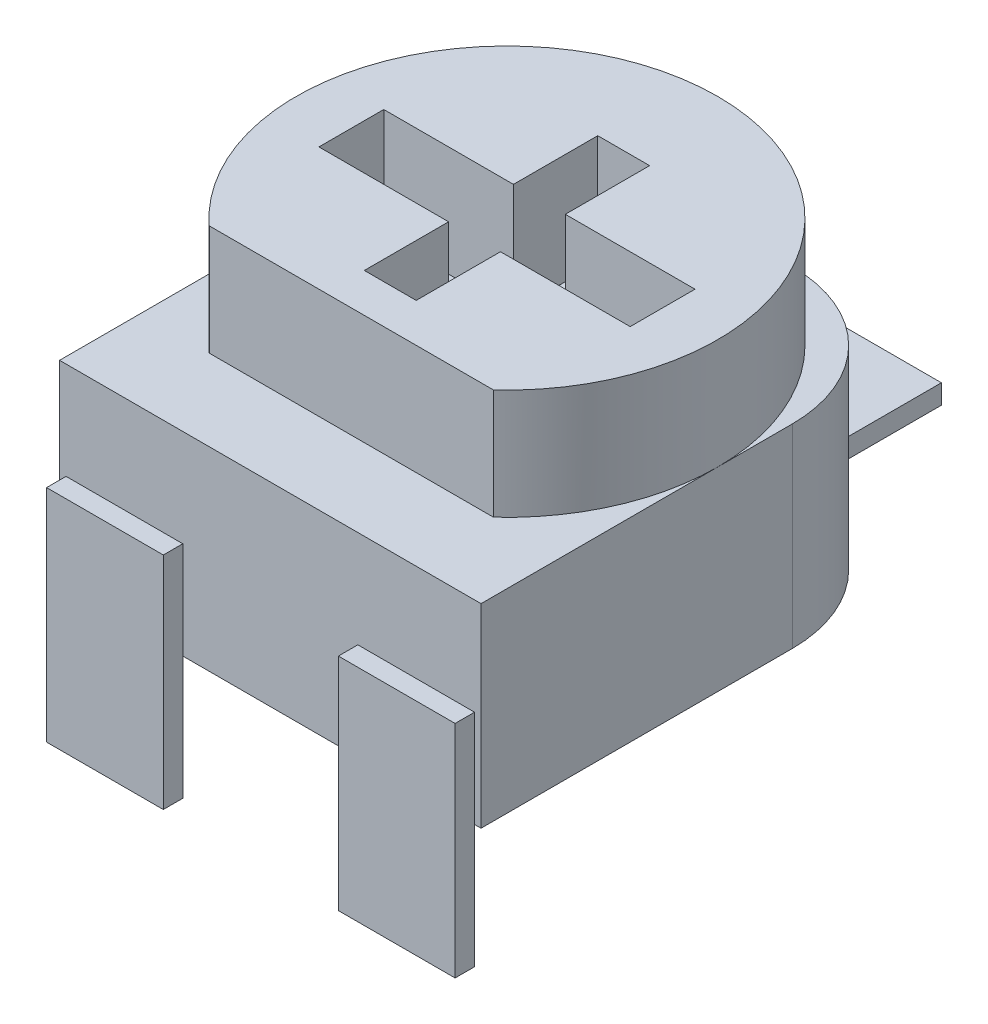
ISO-10303-21;
HEADER;
FILE_DESCRIPTION(('STEP AP214'),'2;1');
FILE_NAME('part.step','',(''),(''),'','','');
FILE_SCHEMA(('AUTOMOTIVE_DESIGN { 1 0 10303 214 1 1 1 1 }'));
ENDSEC;
DATA;
#1=APPLICATION_CONTEXT('core data for automotive mechanical design processes');
#2=APPLICATION_PROTOCOL_DEFINITION('international standard','automotive_design',2000,#1);
#3=PRODUCT_CONTEXT('',#1,'mechanical');
#4=PRODUCT('Part','Part','',(#3));
#5=PRODUCT_RELATED_PRODUCT_CATEGORY('part','',(#4));
#6=PRODUCT_DEFINITION_FORMATION('','',#4);
#7=PRODUCT_DEFINITION_CONTEXT('part definition',#1,'design');
#8=PRODUCT_DEFINITION('design','',#6,#7);
#9=PRODUCT_DEFINITION_SHAPE('','',#8);
#10=(LENGTH_UNIT() NAMED_UNIT(*) SI_UNIT(.MILLI.,.METRE.));
#11=(NAMED_UNIT(*) PLANE_ANGLE_UNIT() SI_UNIT($,.RADIAN.));
#12=(NAMED_UNIT(*) SI_UNIT($,.STERADIAN.) SOLID_ANGLE_UNIT());
#13=UNCERTAINTY_MEASURE_WITH_UNIT(LENGTH_MEASURE(1.E-05),#10,'distance_accuracy_value','');
#14=(GEOMETRIC_REPRESENTATION_CONTEXT(3) GLOBAL_UNCERTAINTY_ASSIGNED_CONTEXT((#13)) GLOBAL_UNIT_ASSIGNED_CONTEXT((#10,
#11,#12)) REPRESENTATION_CONTEXT('',''));
#15=CARTESIAN_POINT('',(0.,0.,0.));
#16=DIRECTION('',(0.,0.,1.));
#17=DIRECTION('',(1.,0.,0.));
#18=AXIS2_PLACEMENT_3D('',#15,#16,#17);
#19=CARTESIAN_POINT('',(-3.25,3.,-3.25));
#20=DIRECTION('',(0.,0.,-1.));
#21=DIRECTION('',(-1.,0.,0.));
#22=AXIS2_PLACEMENT_3D('',#19,#20,#21);
#23=PLANE('',#22);
#24=DIRECTION('',(0.,-1.,0.));
#25=VECTOR('',#24,1.);
#26=CARTESIAN_POINT('',(1.15,3.,-3.25));
#27=LINE('',#26,#25);
#28=CARTESIAN_POINT('',(1.15,3.,-3.25));
#29=VERTEX_POINT('',#28);
#30=CARTESIAN_POINT('',(1.15,0.3,-3.25));
#31=VERTEX_POINT('',#30);
#32=EDGE_CURVE('E540',#29,#31,#27,.T.);
#33=ORIENTED_EDGE('',*,*,#32,.T.);
#34=DIRECTION('',(1.,0.,0.));
#35=VECTOR('',#34,1.);
#36=CARTESIAN_POINT('',(1.15,0.3,-3.25));
#37=LINE('',#36,#35);
#38=CARTESIAN_POINT('',(-1.15,0.3,-3.25));
#39=VERTEX_POINT('',#38);
#40=EDGE_CURVE('E335',#39,#31,#37,.T.);
#41=ORIENTED_EDGE('',*,*,#40,.F.);
#42=DIRECTION('',(0.,-1.,0.));
#43=VECTOR('',#42,1.);
#44=CARTESIAN_POINT('',(-1.15,3.,-3.25));
#45=LINE('',#44,#43);
#46=CARTESIAN_POINT('',(-1.15,3.,-3.25));
#47=VERTEX_POINT('',#46);
#48=EDGE_CURVE('E541',#39,#47,#45,.F.);
#49=ORIENTED_EDGE('',*,*,#48,.T.);
#50=DIRECTION('',(1.,0.,0.));
#51=VECTOR('',#50,1.);
#52=CARTESIAN_POINT('',(-3.25,3.,-3.25));
#53=LINE('',#52,#51);
#54=CARTESIAN_POINT('',(0.,3.,-3.25));
#55=VERTEX_POINT('',#54);
#56=EDGE_CURVE('E511',#47,#55,#53,.T.);
#57=ORIENTED_EDGE('',*,*,#56,.T.);
#58=EDGE_CURVE('E514',#55,#29,#53,.T.);
#59=ORIENTED_EDGE('',*,*,#58,.T.);
#60=EDGE_LOOP('',(#33,#41,#49,#57,#59));
#61=FACE_BOUND('',#60,.T.);
#62=ADVANCED_FACE('F91',(#61),#23,.T.);
#63=CARTESIAN_POINT('',(-3.25,3.,3.65));
#64=DIRECTION('',(0.,0.,-1.));
#65=DIRECTION('',(-1.,0.,0.));
#66=AXIS2_PLACEMENT_3D('',#63,#64,#65);
#67=PLANE('',#66);
#68=DIRECTION('',(0.,-1.,0.));
#69=VECTOR('',#68,1.);
#70=CARTESIAN_POINT('',(1.35,1.5,3.65));
#71=LINE('',#70,#69);
#72=CARTESIAN_POINT('',(1.35,1.5,3.65));
#73=VERTEX_POINT('',#72);
#74=CARTESIAN_POINT('',(1.35,0.,3.65));
#75=VERTEX_POINT('',#74);
#76=EDGE_CURVE('E114',#73,#75,#71,.T.);
#77=ORIENTED_EDGE('',*,*,#76,.F.);
#78=DIRECTION('',(1.,0.,0.));
#79=VECTOR('',#78,1.);
#80=CARTESIAN_POINT('',(1.35,1.5,3.65));
#81=LINE('',#80,#79);
#82=CARTESIAN_POINT('',(3.15,1.5,3.65));
#83=VERTEX_POINT('',#82);
#84=EDGE_CURVE('E364',#73,#83,#81,.T.);
#85=ORIENTED_EDGE('',*,*,#84,.T.);
#86=DIRECTION('',(0.,-1.,0.));
#87=VECTOR('',#86,1.);
#88=CARTESIAN_POINT('',(3.15,1.5,3.65));
#89=LINE('',#88,#87);
#90=CARTESIAN_POINT('',(3.15,0.,3.65));
#91=VERTEX_POINT('',#90);
#92=EDGE_CURVE('E361',#83,#91,#89,.T.);
#93=ORIENTED_EDGE('',*,*,#92,.T.);
#94=DIRECTION('',(1.,0.,0.));
#95=VECTOR('',#94,1.);
#96=CARTESIAN_POINT('',(-3.25,0.,3.65));
#97=LINE('',#96,#95);
#98=CARTESIAN_POINT('',(3.25,0.,3.65));
#99=VERTEX_POINT('',#98);
#100=EDGE_CURVE('E526',#91,#99,#97,.T.);
#101=ORIENTED_EDGE('',*,*,#100,.T.);
#102=DIRECTION('',(0.,-1.,0.));
#103=VECTOR('',#102,1.);
#104=CARTESIAN_POINT('',(3.25,3.,3.65));
#105=LINE('',#104,#103);
#106=CARTESIAN_POINT('',(3.25,3.,3.65));
#107=VERTEX_POINT('',#106);
#108=EDGE_CURVE('E523',#107,#99,#105,.T.);
#109=ORIENTED_EDGE('',*,*,#108,.F.);
#110=DIRECTION('',(1.,0.,0.));
#111=VECTOR('',#110,1.);
#112=CARTESIAN_POINT('',(-3.25,3.,3.65));
#113=LINE('',#112,#111);
#114=CARTESIAN_POINT('',(-3.25,3.,3.65));
#115=VERTEX_POINT('',#114);
#116=EDGE_CURVE('E517',#115,#107,#113,.T.);
#117=ORIENTED_EDGE('',*,*,#116,.F.);
#118=DIRECTION('',(0.,-1.,0.));
#119=VECTOR('',#118,1.);
#120=CARTESIAN_POINT('',(-3.25,3.,3.65));
#121=LINE('',#120,#119);
#122=CARTESIAN_POINT('',(-3.25,0.,3.65));
#123=VERTEX_POINT('',#122);
#124=EDGE_CURVE('E532',#115,#123,#121,.T.);
#125=ORIENTED_EDGE('',*,*,#124,.T.);
#126=CARTESIAN_POINT('',(-3.15,0.,3.65));
#127=VERTEX_POINT('',#126);
#128=EDGE_CURVE('E527',#123,#127,#97,.T.);
#129=ORIENTED_EDGE('',*,*,#128,.T.);
#130=DIRECTION('',(0.,-1.,0.));
#131=VECTOR('',#130,1.);
#132=CARTESIAN_POINT('',(-3.15,1.5,3.65));
#133=LINE('',#132,#131);
#134=CARTESIAN_POINT('',(-3.15,1.5,3.65));
#135=VERTEX_POINT('',#134);
#136=EDGE_CURVE('E380',#135,#127,#133,.T.);
#137=ORIENTED_EDGE('',*,*,#136,.F.);
#138=DIRECTION('',(1.,0.,0.));
#139=VECTOR('',#138,1.);
#140=CARTESIAN_POINT('',(-3.15,1.5,3.65));
#141=LINE('',#140,#139);
#142=CARTESIAN_POINT('',(-1.35,1.5,3.65));
#143=VERTEX_POINT('',#142);
#144=EDGE_CURVE('E366',#135,#143,#141,.T.);
#145=ORIENTED_EDGE('',*,*,#144,.T.);
#146=DIRECTION('',(0.,-1.,0.));
#147=VECTOR('',#146,1.);
#148=CARTESIAN_POINT('',(-1.35,1.5,3.65));
#149=LINE('',#148,#147);
#150=CARTESIAN_POINT('',(-1.35,0.,3.65));
#151=VERTEX_POINT('',#150);
#152=EDGE_CURVE('E390',#143,#151,#149,.T.);
#153=ORIENTED_EDGE('',*,*,#152,.T.);
#154=EDGE_CURVE('E1038',#151,#75,#97,.T.);
#155=ORIENTED_EDGE('',*,*,#154,.T.);
#156=EDGE_LOOP('',(#77,#85,#93,#101,#109,#117,#125,#129,#137,#145,#153,#155));
#157=FACE_BOUND('',#156,.T.);
#158=ADVANCED_FACE('F566',(#157),#67,.F.);
#159=CARTESIAN_POINT('',(0.,4.7,0.));
#160=DIRECTION('',(0.,-1.,0.));
#161=DIRECTION('',(0.,0.,-1.));
#162=AXIS2_PLACEMENT_3D('',#159,#160,#161);
#163=PLANE('',#162);
#164=DIRECTION('',(1.,0.,0.));
#165=VECTOR('',#164,1.);
#166=CARTESIAN_POINT('',(0.,4.7,1.8));
#167=LINE('',#166,#165);
#168=CARTESIAN_POINT('',(-0.4,4.7,1.8));
#169=VERTEX_POINT('',#168);
#170=CARTESIAN_POINT('',(0.4,4.7,1.8));
#171=VERTEX_POINT('',#170);
#172=EDGE_CURVE('E427',#169,#171,#167,.T.);
#173=ORIENTED_EDGE('',*,*,#172,.F.);
#174=DIRECTION('',(0.,0.,-1.));
#175=VECTOR('',#174,1.);
#176=CARTESIAN_POINT('',(-0.4,4.7,0.));
#177=LINE('',#176,#175);
#178=CARTESIAN_POINT('',(-0.4,4.7,0.5));
#179=VERTEX_POINT('',#178);
#180=EDGE_CURVE('E430',#169,#179,#177,.T.);
#181=ORIENTED_EDGE('',*,*,#180,.T.);
#182=DIRECTION('',(1.,0.,0.));
#183=VECTOR('',#182,1.);
#184=CARTESIAN_POINT('',(0.,4.7,0.5));
#185=LINE('',#184,#183);
#186=CARTESIAN_POINT('',(-2.4,4.7,0.5));
#187=VERTEX_POINT('',#186);
#188=EDGE_CURVE('E472',#187,#179,#185,.T.);
#189=ORIENTED_EDGE('',*,*,#188,.F.);
#190=DIRECTION('',(0.,0.,-1.));
#191=VECTOR('',#190,1.);
#192=CARTESIAN_POINT('',(-2.4,4.7,0.));
#193=LINE('',#192,#191);
#194=CARTESIAN_POINT('',(-2.4,4.7,-0.5));
#195=VERTEX_POINT('',#194);
#196=EDGE_CURVE('E468',#187,#195,#193,.T.);
#197=ORIENTED_EDGE('',*,*,#196,.T.);
#198=DIRECTION('',(1.,0.,0.));
#199=VECTOR('',#198,1.);
#200=CARTESIAN_POINT('',(0.,4.7,-0.5));
#201=LINE('',#200,#199);
#202=CARTESIAN_POINT('',(-0.4,4.7,-0.5));
#203=VERTEX_POINT('',#202);
#204=EDGE_CURVE('E465',#195,#203,#201,.T.);
#205=ORIENTED_EDGE('',*,*,#204,.T.);
#206=CARTESIAN_POINT('',(-0.4,4.7,-1.8));
#207=VERTEX_POINT('',#206);
#208=EDGE_CURVE('E429',#203,#207,#177,.T.);
#209=ORIENTED_EDGE('',*,*,#208,.T.);
#210=DIRECTION('',(1.,0.,0.));
#211=VECTOR('',#210,1.);
#212=CARTESIAN_POINT('',(0.,4.7,-1.8));
#213=LINE('',#212,#211);
#214=CARTESIAN_POINT('',(0.4,4.7,-1.8));
#215=VERTEX_POINT('',#214);
#216=EDGE_CURVE('E420',#207,#215,#213,.T.);
#217=ORIENTED_EDGE('',*,*,#216,.T.);
#218=DIRECTION('',(0.,0.,-1.));
#219=VECTOR('',#218,1.);
#220=CARTESIAN_POINT('',(0.4,4.7,0.));
#221=LINE('',#220,#219);
#222=CARTESIAN_POINT('',(0.4,4.7,-0.5));
#223=VERTEX_POINT('',#222);
#224=EDGE_CURVE('E423',#223,#215,#221,.T.);
#225=ORIENTED_EDGE('',*,*,#224,.F.);
#226=CARTESIAN_POINT('',(2.4,4.7,-0.5));
#227=VERTEX_POINT('',#226);
#228=EDGE_CURVE('E463',#223,#227,#201,.T.);
#229=ORIENTED_EDGE('',*,*,#228,.T.);
#230=DIRECTION('',(0.,0.,-1.));
#231=VECTOR('',#230,1.);
#232=CARTESIAN_POINT('',(2.4,4.7,0.));
#233=LINE('',#232,#231);
#234=CARTESIAN_POINT('',(2.4,4.7,0.5));
#235=VERTEX_POINT('',#234);
#236=EDGE_CURVE('E460',#235,#227,#233,.T.);
#237=ORIENTED_EDGE('',*,*,#236,.F.);
#238=CARTESIAN_POINT('',(0.4,4.7,0.5));
#239=VERTEX_POINT('',#238);
#240=EDGE_CURVE('E471',#239,#235,#185,.T.);
#241=ORIENTED_EDGE('',*,*,#240,.F.);
#242=EDGE_CURVE('E425',#171,#239,#221,.T.);
#243=ORIENTED_EDGE('',*,*,#242,.F.);
#244=EDGE_LOOP('',(#173,#181,#189,#197,#205,#209,#217,#225,#229,#237,#241,#243));
#245=FACE_BOUND('',#244,.T.);
#246=DIRECTION('',(1.,0.,0.));
#247=VECTOR('',#246,1.);
#248=CARTESIAN_POINT('',(0.,4.7,2.4));
#249=LINE('',#248,#247);
#250=CARTESIAN_POINT('',(-2.19146070008111,4.7,2.4));
#251=VERTEX_POINT('',#250);
#252=CARTESIAN_POINT('',(2.19146070008111,4.7,2.4));
#253=VERTEX_POINT('',#252);
#254=EDGE_CURVE('E410',#251,#253,#249,.T.);
#255=ORIENTED_EDGE('',*,*,#254,.T.);
#256=CARTESIAN_POINT('',(0.,4.7,0.));
#257=DIRECTION('',(0.,-1.,0.));
#258=DIRECTION('',(0.,0.,-1.));
#259=AXIS2_PLACEMENT_3D('',#256,#257,#258);
#260=CIRCLE('',#259,3.25);
#261=EDGE_CURVE('E498',#251,#253,#260,.T.);
#262=ORIENTED_EDGE('',*,*,#261,.F.);
#263=EDGE_LOOP('',(#255,#262));
#264=FACE_BOUND('',#263,.T.);
#265=ADVANCED_FACE('F607',(#245,#264),#163,.F.);
#266=CARTESIAN_POINT('',(0.,4.7,0.));
#267=DIRECTION('',(0.,-1.,0.));
#268=DIRECTION('',(0.,0.,-1.));
#269=AXIS2_PLACEMENT_3D('',#266,#267,#268);
#270=CYLINDRICAL_SURFACE('',#269,3.25);
#271=CARTESIAN_POINT('',(0.,3.,0.));
#272=DIRECTION('',(0.,-1.,0.));
#273=DIRECTION('',(0.,0.,-1.));
#274=AXIS2_PLACEMENT_3D('',#271,#272,#273);
#275=CIRCLE('',#274,3.25);
#276=CARTESIAN_POINT('',(-2.19146070008111,3.,2.4));
#277=VERTEX_POINT('',#276);
#278=CARTESIAN_POINT('',(-3.25,3.,0.));
#279=VERTEX_POINT('',#278);
#280=EDGE_CURVE('E504',#277,#279,#275,.T.);
#281=ORIENTED_EDGE('',*,*,#280,.F.);
#282=DIRECTION('',(0.,1.,0.));
#283=VECTOR('',#282,1.);
#284=CARTESIAN_POINT('',(-2.19146070008111,-1.4645828472546,2.4));
#285=LINE('',#284,#283);
#286=EDGE_CURVE('E414',#277,#251,#285,.T.);
#287=ORIENTED_EDGE('',*,*,#286,.T.);
#288=ORIENTED_EDGE('',*,*,#261,.T.);
#289=DIRECTION('',(0.,1.,0.));
#290=VECTOR('',#289,1.);
#291=CARTESIAN_POINT('',(2.19146070008111,-1.4645828472546,2.4));
#292=LINE('',#291,#290);
#293=CARTESIAN_POINT('',(2.19146070008111,3.,2.4));
#294=VERTEX_POINT('',#293);
#295=EDGE_CURVE('E401',#294,#253,#292,.T.);
#296=ORIENTED_EDGE('',*,*,#295,.F.);
#297=CARTESIAN_POINT('',(3.25,3.,0.));
#298=VERTEX_POINT('',#297);
#299=EDGE_CURVE('E578',#298,#294,#275,.T.);
#300=ORIENTED_EDGE('',*,*,#299,.F.);
#301=EDGE_CURVE('E497',#55,#298,#275,.T.);
#302=ORIENTED_EDGE('',*,*,#301,.F.);
#303=EDGE_CURVE('E505',#279,#55,#275,.T.);
#304=ORIENTED_EDGE('',*,*,#303,.F.);
#305=EDGE_LOOP('',(#281,#287,#288,#296,#300,#302,#304));
#306=FACE_BOUND('',#305,.T.);
#307=ADVANCED_FACE('F581',(#306),#270,.T.);
#308=CARTESIAN_POINT('',(0.,3.,0.));
#309=DIRECTION('',(0.,-1.,0.));
#310=DIRECTION('',(0.,0.,-1.));
#311=AXIS2_PLACEMENT_3D('',#308,#309,#310);
#312=PLANE('',#311);
#313=DIRECTION('',(0.,0.,1.));
#314=VECTOR('',#313,1.);
#315=CARTESIAN_POINT('',(3.25,3.,-3.25));
#316=LINE('',#315,#314);
#317=CARTESIAN_POINT('',(3.25,3.,-1.15));
#318=VERTEX_POINT('',#317);
#319=EDGE_CURVE('E515',#318,#298,#316,.T.);
#320=ORIENTED_EDGE('',*,*,#319,.F.);
#321=CARTESIAN_POINT('',(1.15,3.,-1.15));
#322=DIRECTION('',(0.,-1.,0.));
#323=DIRECTION('',(0.,0.,-1.));
#324=AXIS2_PLACEMENT_3D('',#321,#322,#323);
#325=CIRCLE('',#324,2.1);
#326=EDGE_CURVE('E549',#318,#29,#325,.F.);
#327=ORIENTED_EDGE('',*,*,#326,.T.);
#328=ORIENTED_EDGE('',*,*,#58,.F.);
#329=ORIENTED_EDGE('',*,*,#301,.T.);
#330=EDGE_LOOP('',(#320,#327,#328,#329));
#331=FACE_BOUND('',#330,.T.);
#332=ADVANCED_FACE('F624',(#331),#312,.F.);
#333=EDGE_CURVE('E513',#298,#107,#316,.T.);
#334=ORIENTED_EDGE('',*,*,#333,.F.);
#335=ORIENTED_EDGE('',*,*,#299,.T.);
#336=DIRECTION('',(1.,0.,0.));
#337=VECTOR('',#336,1.);
#338=CARTESIAN_POINT('',(0.,3.,2.4));
#339=LINE('',#338,#337);
#340=EDGE_CURVE('E413',#277,#294,#339,.T.);
#341=ORIENTED_EDGE('',*,*,#340,.F.);
#342=ORIENTED_EDGE('',*,*,#280,.T.);
#343=DIRECTION('',(0.,0.,1.));
#344=VECTOR('',#343,1.);
#345=CARTESIAN_POINT('',(-3.25,3.,-3.25));
#346=LINE('',#345,#344);
#347=EDGE_CURVE('E520',#279,#115,#346,.T.);
#348=ORIENTED_EDGE('',*,*,#347,.T.);
#349=ORIENTED_EDGE('',*,*,#116,.T.);
#350=EDGE_LOOP('',(#334,#335,#341,#342,#348,#349));
#351=FACE_BOUND('',#350,.T.);
#352=ADVANCED_FACE('F572',(#351),#312,.F.);
#353=CARTESIAN_POINT('',(-3.25,3.,-3.25));
#354=DIRECTION('',(1.,0.,0.));
#355=DIRECTION('',(0.,0.,-1.));
#356=AXIS2_PLACEMENT_3D('',#353,#354,#355);
#357=PLANE('',#356);
#358=CARTESIAN_POINT('',(-3.25,3.,-1.15));
#359=VERTEX_POINT('',#358);
#360=EDGE_CURVE('E521',#359,#279,#346,.T.);
#361=ORIENTED_EDGE('',*,*,#360,.F.);
#362=DIRECTION('',(0.,-1.,0.));
#363=VECTOR('',#362,1.);
#364=CARTESIAN_POINT('',(-3.25,0.,-1.15));
#365=LINE('',#364,#363);
#366=CARTESIAN_POINT('',(-3.25,0.,-1.15));
#367=VERTEX_POINT('',#366);
#368=EDGE_CURVE('E99',#359,#367,#365,.T.);
#369=ORIENTED_EDGE('',*,*,#368,.T.);
#370=DIRECTION('',(0.,0.,1.));
#371=VECTOR('',#370,1.);
#372=CARTESIAN_POINT('',(-3.25,0.,-3.25));
#373=LINE('',#372,#371);
#374=EDGE_CURVE('E529',#367,#123,#373,.T.);
#375=ORIENTED_EDGE('',*,*,#374,.T.);
#376=ORIENTED_EDGE('',*,*,#124,.F.);
#377=ORIENTED_EDGE('',*,*,#347,.F.);
#378=EDGE_LOOP('',(#361,#369,#375,#376,#377));
#379=FACE_BOUND('',#378,.T.);
#380=ADVANCED_FACE('F555',(#379),#357,.F.);
#381=CARTESIAN_POINT('',(3.25,3.,-3.25));
#382=DIRECTION('',(1.,0.,0.));
#383=DIRECTION('',(0.,0.,-1.));
#384=AXIS2_PLACEMENT_3D('',#381,#382,#383);
#385=PLANE('',#384);
#386=DIRECTION('',(0.,0.,1.));
#387=VECTOR('',#386,1.);
#388=CARTESIAN_POINT('',(3.25,0.,-3.25));
#389=LINE('',#388,#387);
#390=CARTESIAN_POINT('',(3.25,0.,-1.15));
#391=VERTEX_POINT('',#390);
#392=EDGE_CURVE('E510',#391,#99,#389,.T.);
#393=ORIENTED_EDGE('',*,*,#392,.F.);
#394=DIRECTION('',(0.,-1.,0.));
#395=VECTOR('',#394,1.);
#396=CARTESIAN_POINT('',(3.25,3.,-1.15));
#397=LINE('',#396,#395);
#398=EDGE_CURVE('E547',#391,#318,#397,.F.);
#399=ORIENTED_EDGE('',*,*,#398,.T.);
#400=ORIENTED_EDGE('',*,*,#319,.T.);
#401=ORIENTED_EDGE('',*,*,#333,.T.);
#402=ORIENTED_EDGE('',*,*,#108,.T.);
#403=EDGE_LOOP('',(#393,#399,#400,#401,#402));
#404=FACE_BOUND('',#403,.T.);
#405=ADVANCED_FACE('F610',(#404),#385,.T.);
#406=ORIENTED_EDGE('',*,*,#56,.F.);
#407=CARTESIAN_POINT('',(-1.15,3.,-1.15));
#408=DIRECTION('',(0.,-1.,0.));
#409=DIRECTION('',(0.,0.,-1.));
#410=AXIS2_PLACEMENT_3D('',#407,#408,#409);
#411=CIRCLE('',#410,2.1);
#412=EDGE_CURVE('E12',#47,#359,#411,.F.);
#413=ORIENTED_EDGE('',*,*,#412,.T.);
#414=ORIENTED_EDGE('',*,*,#360,.T.);
#415=ORIENTED_EDGE('',*,*,#303,.T.);
#416=EDGE_LOOP('',(#406,#413,#414,#415));
#417=FACE_BOUND('',#416,.T.);
#418=ADVANCED_FACE('F590',(#417),#312,.F.);
#419=CARTESIAN_POINT('',(0.,0.,0.));
#420=DIRECTION('',(0.,-1.,0.));
#421=DIRECTION('',(0.,0.,-1.));
#422=AXIS2_PLACEMENT_3D('',#419,#420,#421);
#423=PLANE('',#422);
#424=CARTESIAN_POINT('',(-1.15,0.,-1.15));
#425=DIRECTION('',(0.,-1.,0.));
#426=DIRECTION('',(0.,0.,-1.));
#427=AXIS2_PLACEMENT_3D('',#424,#425,#426);
#428=CIRCLE('',#427,2.1);
#429=CARTESIAN_POINT('',(-1.15,0.,-3.25));
#430=VERTEX_POINT('',#429);
#431=EDGE_CURVE('E543',#367,#430,#428,.T.);
#432=ORIENTED_EDGE('',*,*,#431,.T.);
#433=DIRECTION('',(0.,0.,1.));
#434=VECTOR('',#433,1.);
#435=CARTESIAN_POINT('',(-1.15,0.,-5.55));
#436=LINE('',#435,#434);
#437=CARTESIAN_POINT('',(-1.15,0.,-5.55));
#438=VERTEX_POINT('',#437);
#439=EDGE_CURVE('E322',#438,#430,#436,.T.);
#440=ORIENTED_EDGE('',*,*,#439,.F.);
#441=DIRECTION('',(-1.,0.,0.));
#442=VECTOR('',#441,1.);
#443=CARTESIAN_POINT('',(1.15,0.,-5.55));
#444=LINE('',#443,#442);
#445=CARTESIAN_POINT('',(1.15,0.,-5.55));
#446=VERTEX_POINT('',#445);
#447=EDGE_CURVE('E316',#446,#438,#444,.T.);
#448=ORIENTED_EDGE('',*,*,#447,.F.);
#449=DIRECTION('',(0.,0.,1.));
#450=VECTOR('',#449,1.);
#451=CARTESIAN_POINT('',(1.15,0.,-5.55));
#452=LINE('',#451,#450);
#453=CARTESIAN_POINT('',(1.15,0.,-3.25));
#454=VERTEX_POINT('',#453);
#455=EDGE_CURVE('E320',#446,#454,#452,.T.);
#456=ORIENTED_EDGE('',*,*,#455,.T.);
#457=CARTESIAN_POINT('',(1.15,0.,-1.15));
#458=DIRECTION('',(0.,-1.,0.));
#459=DIRECTION('',(0.,0.,-1.));
#460=AXIS2_PLACEMENT_3D('',#457,#458,#459);
#461=CIRCLE('',#460,2.1);
#462=EDGE_CURVE('E545',#454,#391,#461,.T.);
#463=ORIENTED_EDGE('',*,*,#462,.T.);
#464=ORIENTED_EDGE('',*,*,#392,.T.);
#465=ORIENTED_EDGE('',*,*,#100,.F.);
#466=EDGE_CURVE('E1032',#75,#91,#97,.T.);
#467=ORIENTED_EDGE('',*,*,#466,.F.);
#468=ORIENTED_EDGE('',*,*,#154,.F.);
#469=EDGE_CURVE('E530',#127,#151,#97,.T.);
#470=ORIENTED_EDGE('',*,*,#469,.F.);
#471=ORIENTED_EDGE('',*,*,#128,.F.);
#472=ORIENTED_EDGE('',*,*,#374,.F.);
#473=EDGE_LOOP('',(#432,#440,#448,#456,#463,#464,#465,#467,#468,#470,#471,#472));
#474=FACE_BOUND('',#473,.T.);
#475=ADVANCED_FACE('F318',(#474),#423,.T.);
#476=CARTESIAN_POINT('',(0.,4.7,-0.5));
#477=DIRECTION('',(0.,0.,-1.));
#478=DIRECTION('',(-1.,0.,0.));
#479=AXIS2_PLACEMENT_3D('',#476,#477,#478);
#480=PLANE('',#479);
#481=DIRECTION('',(0.,1.,0.));
#482=VECTOR('',#481,1.);
#483=CARTESIAN_POINT('',(0.4,4.7,-0.5));
#484=LINE('',#483,#482);
#485=CARTESIAN_POINT('',(0.4,3.,-0.5));
#486=VERTEX_POINT('',#485);
#487=EDGE_CURVE('E449',#486,#223,#484,.T.);
#488=ORIENTED_EDGE('',*,*,#487,.F.);
#489=DIRECTION('',(1.,0.,0.));
#490=VECTOR('',#489,1.);
#491=CARTESIAN_POINT('',(0.,3.,-0.5));
#492=LINE('',#491,#490);
#493=CARTESIAN_POINT('',(2.4,3.,-0.5));
#494=VERTEX_POINT('',#493);
#495=EDGE_CURVE('E478',#486,#494,#492,.T.);
#496=ORIENTED_EDGE('',*,*,#495,.T.);
#497=DIRECTION('',(0.,-1.,0.));
#498=VECTOR('',#497,1.);
#499=CARTESIAN_POINT('',(2.4,4.7,-0.5));
#500=LINE('',#499,#498);
#501=EDGE_CURVE('E494',#227,#494,#500,.T.);
#502=ORIENTED_EDGE('',*,*,#501,.F.);
#503=ORIENTED_EDGE('',*,*,#228,.F.);
#504=EDGE_LOOP('',(#488,#496,#502,#503));
#505=FACE_BOUND('',#504,.T.);
#506=ADVANCED_FACE('F618',(#505),#480,.F.);
#507=CARTESIAN_POINT('',(0.,4.7,0.5));
#508=DIRECTION('',(0.,0.,-1.));
#509=DIRECTION('',(-1.,0.,0.));
#510=AXIS2_PLACEMENT_3D('',#507,#508,#509);
#511=PLANE('',#510);
#512=DIRECTION('',(1.,0.,0.));
#513=VECTOR('',#512,1.);
#514=CARTESIAN_POINT('',(0.,3.,0.5));
#515=LINE('',#514,#513);
#516=CARTESIAN_POINT('',(0.4,3.,0.5));
#517=VERTEX_POINT('',#516);
#518=CARTESIAN_POINT('',(2.4,3.,0.5));
#519=VERTEX_POINT('',#518);
#520=EDGE_CURVE('E485',#517,#519,#515,.T.);
#521=ORIENTED_EDGE('',*,*,#520,.F.);
#522=DIRECTION('',(0.,1.,0.));
#523=VECTOR('',#522,1.);
#524=CARTESIAN_POINT('',(0.4,4.7,0.5));
#525=LINE('',#524,#523);
#526=EDGE_CURVE('E501',#517,#239,#525,.T.);
#527=ORIENTED_EDGE('',*,*,#526,.T.);
#528=ORIENTED_EDGE('',*,*,#240,.T.);
#529=DIRECTION('',(0.,-1.,0.));
#530=VECTOR('',#529,1.);
#531=CARTESIAN_POINT('',(2.4,4.7,0.5));
#532=LINE('',#531,#530);
#533=EDGE_CURVE('E475',#235,#519,#532,.T.);
#534=ORIENTED_EDGE('',*,*,#533,.T.);
#535=EDGE_LOOP('',(#521,#527,#528,#534));
#536=FACE_BOUND('',#535,.T.);
#537=ADVANCED_FACE('F632',(#536),#511,.T.);
#538=CARTESIAN_POINT('',(2.4,4.7,0.));
#539=DIRECTION('',(-1.,0.,0.));
#540=DIRECTION('',(0.,0.,1.));
#541=AXIS2_PLACEMENT_3D('',#538,#539,#540);
#542=PLANE('',#541);
#543=DIRECTION('',(0.,0.,-1.));
#544=VECTOR('',#543,1.);
#545=CARTESIAN_POINT('',(2.4,3.,0.));
#546=LINE('',#545,#544);
#547=EDGE_CURVE('E459',#519,#494,#546,.T.);
#548=ORIENTED_EDGE('',*,*,#547,.F.);
#549=ORIENTED_EDGE('',*,*,#533,.F.);
#550=ORIENTED_EDGE('',*,*,#236,.T.);
#551=ORIENTED_EDGE('',*,*,#501,.T.);
#552=EDGE_LOOP('',(#548,#549,#550,#551));
#553=FACE_BOUND('',#552,.T.);
#554=ADVANCED_FACE('F628',(#553),#542,.T.);
#555=CARTESIAN_POINT('',(-2.4,3.,-0.5));
#556=VERTEX_POINT('',#555);
#557=CARTESIAN_POINT('',(-0.4,3.,-0.5));
#558=VERTEX_POINT('',#557);
#559=EDGE_CURVE('E479',#556,#558,#492,.T.);
#560=ORIENTED_EDGE('',*,*,#559,.T.);
#561=DIRECTION('',(0.,1.,0.));
#562=VECTOR('',#561,1.);
#563=CARTESIAN_POINT('',(-0.4,4.7,-0.5));
#564=LINE('',#563,#562);
#565=EDGE_CURVE('E456',#558,#203,#564,.T.);
#566=ORIENTED_EDGE('',*,*,#565,.T.);
#567=ORIENTED_EDGE('',*,*,#204,.F.);
#568=DIRECTION('',(0.,-1.,0.));
#569=VECTOR('',#568,1.);
#570=CARTESIAN_POINT('',(-2.4,4.7,-0.5));
#571=LINE('',#570,#569);
#572=EDGE_CURVE('E492',#195,#556,#571,.T.);
#573=ORIENTED_EDGE('',*,*,#572,.T.);
#574=EDGE_LOOP('',(#560,#566,#567,#573));
#575=FACE_BOUND('',#574,.T.);
#576=ADVANCED_FACE('F631',(#575),#480,.F.);
#577=CARTESIAN_POINT('',(-2.4,4.7,0.));
#578=DIRECTION('',(-1.,0.,0.));
#579=DIRECTION('',(0.,0.,1.));
#580=AXIS2_PLACEMENT_3D('',#577,#578,#579);
#581=PLANE('',#580);
#582=DIRECTION('',(0.,0.,-1.));
#583=VECTOR('',#582,1.);
#584=CARTESIAN_POINT('',(-2.4,3.,0.));
#585=LINE('',#584,#583);
#586=CARTESIAN_POINT('',(-2.4,3.,0.5));
#587=VERTEX_POINT('',#586);
#588=EDGE_CURVE('E482',#587,#556,#585,.T.);
#589=ORIENTED_EDGE('',*,*,#588,.T.);
#590=ORIENTED_EDGE('',*,*,#572,.F.);
#591=ORIENTED_EDGE('',*,*,#196,.F.);
#592=DIRECTION('',(0.,-1.,0.));
#593=VECTOR('',#592,1.);
#594=CARTESIAN_POINT('',(-2.4,4.7,0.5));
#595=LINE('',#594,#593);
#596=EDGE_CURVE('E490',#187,#587,#595,.T.);
#597=ORIENTED_EDGE('',*,*,#596,.T.);
#598=EDGE_LOOP('',(#589,#590,#591,#597));
#599=FACE_BOUND('',#598,.T.);
#600=ADVANCED_FACE('F636',(#599),#581,.F.);
#601=DIRECTION('',(0.,1.,0.));
#602=VECTOR('',#601,1.);
#603=CARTESIAN_POINT('',(-0.4,4.7,0.5));
#604=LINE('',#603,#602);
#605=CARTESIAN_POINT('',(-0.4,3.,0.5));
#606=VERTEX_POINT('',#605);
#607=EDGE_CURVE('E508',#606,#179,#604,.T.);
#608=ORIENTED_EDGE('',*,*,#607,.F.);
#609=EDGE_CURVE('E464',#587,#606,#515,.T.);
#610=ORIENTED_EDGE('',*,*,#609,.F.);
#611=ORIENTED_EDGE('',*,*,#596,.F.);
#612=ORIENTED_EDGE('',*,*,#188,.T.);
#613=EDGE_LOOP('',(#608,#610,#611,#612));
#614=FACE_BOUND('',#613,.T.);
#615=ADVANCED_FACE('F640',(#614),#511,.T.);
#616=CARTESIAN_POINT('',(-0.4,4.7,0.));
#617=DIRECTION('',(-1.,0.,0.));
#618=DIRECTION('',(0.,0.,1.));
#619=AXIS2_PLACEMENT_3D('',#616,#617,#618);
#620=PLANE('',#619);
#621=ORIENTED_EDGE('',*,*,#607,.T.);
#622=ORIENTED_EDGE('',*,*,#180,.F.);
#623=DIRECTION('',(0.,-1.,0.));
#624=VECTOR('',#623,1.);
#625=CARTESIAN_POINT('',(-0.4,4.7,1.8));
#626=LINE('',#625,#624);
#627=CARTESIAN_POINT('',(-0.4,3.,1.8));
#628=VERTEX_POINT('',#627);
#629=EDGE_CURVE('E450',#169,#628,#626,.T.);
#630=ORIENTED_EDGE('',*,*,#629,.T.);
#631=DIRECTION('',(0.,0.,-1.));
#632=VECTOR('',#631,1.);
#633=CARTESIAN_POINT('',(-0.4,3.,0.));
#634=LINE('',#633,#632);
#635=EDGE_CURVE('E424',#628,#606,#634,.T.);
#636=ORIENTED_EDGE('',*,*,#635,.T.);
#637=EDGE_LOOP('',(#621,#622,#630,#636));
#638=FACE_BOUND('',#637,.T.);
#639=ADVANCED_FACE('F644',(#638),#620,.F.);
#640=CARTESIAN_POINT('',(0.4,4.7,0.));
#641=DIRECTION('',(-1.,0.,0.));
#642=DIRECTION('',(0.,0.,1.));
#643=AXIS2_PLACEMENT_3D('',#640,#641,#642);
#644=PLANE('',#643);
#645=DIRECTION('',(0.,0.,-1.));
#646=VECTOR('',#645,1.);
#647=CARTESIAN_POINT('',(0.4,3.,0.));
#648=LINE('',#647,#646);
#649=CARTESIAN_POINT('',(0.4,3.,1.8));
#650=VERTEX_POINT('',#649);
#651=EDGE_CURVE('E437',#650,#517,#648,.T.);
#652=ORIENTED_EDGE('',*,*,#651,.F.);
#653=DIRECTION('',(0.,-1.,0.));
#654=VECTOR('',#653,1.);
#655=CARTESIAN_POINT('',(0.4,4.7,1.8));
#656=LINE('',#655,#654);
#657=EDGE_CURVE('E452',#171,#650,#656,.T.);
#658=ORIENTED_EDGE('',*,*,#657,.F.);
#659=ORIENTED_EDGE('',*,*,#242,.T.);
#660=ORIENTED_EDGE('',*,*,#526,.F.);
#661=EDGE_LOOP('',(#652,#658,#659,#660));
#662=FACE_BOUND('',#661,.T.);
#663=ADVANCED_FACE('F651',(#662),#644,.T.);
#664=CARTESIAN_POINT('',(0.,4.7,1.8));
#665=DIRECTION('',(0.,0.,-1.));
#666=DIRECTION('',(-1.,0.,0.));
#667=AXIS2_PLACEMENT_3D('',#664,#665,#666);
#668=PLANE('',#667);
#669=DIRECTION('',(1.,0.,0.));
#670=VECTOR('',#669,1.);
#671=CARTESIAN_POINT('',(0.,3.,1.8));
#672=LINE('',#671,#670);
#673=EDGE_CURVE('E440',#628,#650,#672,.T.);
#674=ORIENTED_EDGE('',*,*,#673,.F.);
#675=ORIENTED_EDGE('',*,*,#629,.F.);
#676=ORIENTED_EDGE('',*,*,#172,.T.);
#677=ORIENTED_EDGE('',*,*,#657,.T.);
#678=EDGE_LOOP('',(#674,#675,#676,#677));
#679=FACE_BOUND('',#678,.T.);
#680=ADVANCED_FACE('F654',(#679),#668,.T.);
#681=CARTESIAN_POINT('',(-0.4,3.,-1.8));
#682=VERTEX_POINT('',#681);
#683=EDGE_CURVE('E443',#558,#682,#634,.T.);
#684=ORIENTED_EDGE('',*,*,#683,.T.);
#685=DIRECTION('',(0.,-1.,0.));
#686=VECTOR('',#685,1.);
#687=CARTESIAN_POINT('',(-0.4,4.7,-1.8));
#688=LINE('',#687,#686);
#689=EDGE_CURVE('E446',#207,#682,#688,.T.);
#690=ORIENTED_EDGE('',*,*,#689,.F.);
#691=ORIENTED_EDGE('',*,*,#208,.F.);
#692=ORIENTED_EDGE('',*,*,#565,.F.);
#693=EDGE_LOOP('',(#684,#690,#691,#692));
#694=FACE_BOUND('',#693,.T.);
#695=ADVANCED_FACE('F658',(#694),#620,.F.);
#696=ORIENTED_EDGE('',*,*,#487,.T.);
#697=ORIENTED_EDGE('',*,*,#224,.T.);
#698=DIRECTION('',(0.,-1.,0.));
#699=VECTOR('',#698,1.);
#700=CARTESIAN_POINT('',(0.4,4.7,-1.8));
#701=LINE('',#700,#699);
#702=CARTESIAN_POINT('',(0.4,3.,-1.8));
#703=VERTEX_POINT('',#702);
#704=EDGE_CURVE('E433',#215,#703,#701,.T.);
#705=ORIENTED_EDGE('',*,*,#704,.T.);
#706=EDGE_CURVE('E436',#486,#703,#648,.T.);
#707=ORIENTED_EDGE('',*,*,#706,.F.);
#708=EDGE_LOOP('',(#696,#697,#705,#707));
#709=FACE_BOUND('',#708,.T.);
#710=ADVANCED_FACE('F649',(#709),#644,.T.);
#711=CARTESIAN_POINT('',(0.,4.7,-1.8));
#712=DIRECTION('',(0.,0.,-1.));
#713=DIRECTION('',(-1.,0.,0.));
#714=AXIS2_PLACEMENT_3D('',#711,#712,#713);
#715=PLANE('',#714);
#716=DIRECTION('',(1.,0.,0.));
#717=VECTOR('',#716,1.);
#718=CARTESIAN_POINT('',(0.,3.,-1.8));
#719=LINE('',#718,#717);
#720=EDGE_CURVE('E416',#682,#703,#719,.T.);
#721=ORIENTED_EDGE('',*,*,#720,.T.);
#722=ORIENTED_EDGE('',*,*,#704,.F.);
#723=ORIENTED_EDGE('',*,*,#216,.F.);
#724=ORIENTED_EDGE('',*,*,#689,.T.);
#725=EDGE_LOOP('',(#721,#722,#723,#724));
#726=FACE_BOUND('',#725,.T.);
#727=ADVANCED_FACE('F646',(#726),#715,.F.);
#728=ORIENTED_EDGE('',*,*,#635,.F.);
#729=ORIENTED_EDGE('',*,*,#673,.T.);
#730=ORIENTED_EDGE('',*,*,#651,.T.);
#731=ORIENTED_EDGE('',*,*,#520,.T.);
#732=ORIENTED_EDGE('',*,*,#547,.T.);
#733=ORIENTED_EDGE('',*,*,#495,.F.);
#734=ORIENTED_EDGE('',*,*,#706,.T.);
#735=ORIENTED_EDGE('',*,*,#720,.F.);
#736=ORIENTED_EDGE('',*,*,#683,.F.);
#737=ORIENTED_EDGE('',*,*,#559,.F.);
#738=ORIENTED_EDGE('',*,*,#588,.F.);
#739=ORIENTED_EDGE('',*,*,#609,.T.);
#740=EDGE_LOOP('',(#728,#729,#730,#731,#732,#733,#734,#735,#736,#737,#738,#739));
#741=FACE_BOUND('',#740,.T.);
#742=ADVANCED_FACE('F621',(#741),#312,.F.);
#743=CARTESIAN_POINT('',(0.,-1.4645828472546,2.4));
#744=DIRECTION('',(0.,0.,1.));
#745=DIRECTION('',(1.,0.,0.));
#746=AXIS2_PLACEMENT_3D('',#743,#744,#745);
#747=PLANE('',#746);
#748=ORIENTED_EDGE('',*,*,#340,.T.);
#749=ORIENTED_EDGE('',*,*,#295,.T.);
#750=ORIENTED_EDGE('',*,*,#254,.F.);
#751=ORIENTED_EDGE('',*,*,#286,.F.);
#752=EDGE_LOOP('',(#748,#749,#750,#751));
#753=FACE_BOUND('',#752,.T.);
#754=ADVANCED_FACE('F601',(#753),#747,.T.);
#755=CARTESIAN_POINT('',(1.15,3.,-1.15));
#756=DIRECTION('',(0.,-1.,0.));
#757=DIRECTION('',(0.,0.,-1.));
#758=AXIS2_PLACEMENT_3D('',#755,#756,#757);
#759=CYLINDRICAL_SURFACE('',#758,2.1);
#760=ORIENTED_EDGE('',*,*,#326,.F.);
#761=ORIENTED_EDGE('',*,*,#398,.F.);
#762=ORIENTED_EDGE('',*,*,#462,.F.);
#763=DIRECTION('',(0.,-1.,0.));
#764=VECTOR('',#763,1.);
#765=CARTESIAN_POINT('',(1.15,0.,-3.25));
#766=LINE('',#765,#764);
#767=EDGE_CURVE('E106',#31,#454,#766,.T.);
#768=ORIENTED_EDGE('',*,*,#767,.F.);
#769=ORIENTED_EDGE('',*,*,#32,.F.);
#770=EDGE_LOOP('',(#760,#761,#762,#768,#769));
#771=FACE_BOUND('',#770,.T.);
#772=ADVANCED_FACE('F593',(#771),#759,.T.);
#773=CARTESIAN_POINT('',(-1.15,3.,-1.15));
#774=DIRECTION('',(0.,1.,0.));
#775=DIRECTION('',(0.,0.,1.));
#776=AXIS2_PLACEMENT_3D('',#773,#774,#775);
#777=CYLINDRICAL_SURFACE('',#776,2.1);
#778=ORIENTED_EDGE('',*,*,#412,.F.);
#779=ORIENTED_EDGE('',*,*,#48,.F.);
#780=EDGE_CURVE('E537',#430,#39,#45,.F.);
#781=ORIENTED_EDGE('',*,*,#780,.F.);
#782=ORIENTED_EDGE('',*,*,#431,.F.);
#783=ORIENTED_EDGE('',*,*,#368,.F.);
#784=EDGE_LOOP('',(#778,#779,#781,#782,#783));
#785=FACE_BOUND('',#784,.T.);
#786=ADVANCED_FACE('F93',(#785),#777,.T.);
#787=CARTESIAN_POINT('',(-3.15,1.5,3.95));
#788=DIRECTION('',(0.,1.,0.));
#789=DIRECTION('',(0.,0.,1.));
#790=AXIS2_PLACEMENT_3D('',#787,#788,#789);
#791=PLANE('',#790);
#792=ORIENTED_EDGE('',*,*,#144,.F.);
#793=DIRECTION('',(0.,0.,-1.));
#794=VECTOR('',#793,1.);
#795=CARTESIAN_POINT('',(-3.15,1.5,3.95));
#796=LINE('',#795,#794);
#797=CARTESIAN_POINT('',(-3.15,1.5,3.95));
#798=VERTEX_POINT('',#797);
#799=EDGE_CURVE('E398',#798,#135,#796,.T.);
#800=ORIENTED_EDGE('',*,*,#799,.F.);
#801=DIRECTION('',(1.,0.,0.));
#802=VECTOR('',#801,1.);
#803=CARTESIAN_POINT('',(-3.15,1.5,3.95));
#804=LINE('',#803,#802);
#805=CARTESIAN_POINT('',(-1.35,1.5,3.95));
#806=VERTEX_POINT('',#805);
#807=EDGE_CURVE('E376',#798,#806,#804,.T.);
#808=ORIENTED_EDGE('',*,*,#807,.T.);
#809=DIRECTION('',(0.,0.,-1.));
#810=VECTOR('',#809,1.);
#811=CARTESIAN_POINT('',(-1.35,1.5,3.95));
#812=LINE('',#811,#810);
#813=EDGE_CURVE('E387',#806,#143,#812,.T.);
#814=ORIENTED_EDGE('',*,*,#813,.T.);
#815=EDGE_LOOP('',(#792,#800,#808,#814));
#816=FACE_BOUND('',#815,.T.);
#817=ADVANCED_FACE('F592',(#816),#791,.T.);
#818=CARTESIAN_POINT('',(-3.15,1.5,3.95));
#819=DIRECTION('',(1.,0.,0.));
#820=DIRECTION('',(0.,0.,-1.));
#821=AXIS2_PLACEMENT_3D('',#818,#819,#820);
#822=PLANE('',#821);
#823=ORIENTED_EDGE('',*,*,#136,.T.);
#824=CARTESIAN_POINT('',(-3.15,-1.9,3.65));
#825=VERTEX_POINT('',#824);
#826=EDGE_CURVE('E395',#127,#825,#133,.T.);
#827=ORIENTED_EDGE('',*,*,#826,.T.);
#828=DIRECTION('',(0.,0.,-1.));
#829=VECTOR('',#828,1.);
#830=CARTESIAN_POINT('',(-3.15,-1.9,3.95));
#831=LINE('',#830,#829);
#832=CARTESIAN_POINT('',(-3.15,-1.9,3.95));
#833=VERTEX_POINT('',#832);
#834=EDGE_CURVE('E402',#833,#825,#831,.T.);
#835=ORIENTED_EDGE('',*,*,#834,.F.);
#836=DIRECTION('',(0.,-1.,0.));
#837=VECTOR('',#836,1.);
#838=CARTESIAN_POINT('',(-3.15,1.5,3.95));
#839=LINE('',#838,#837);
#840=EDGE_CURVE('E385',#798,#833,#839,.T.);
#841=ORIENTED_EDGE('',*,*,#840,.F.);
#842=ORIENTED_EDGE('',*,*,#799,.T.);
#843=EDGE_LOOP('',(#823,#827,#835,#841,#842));
#844=FACE_BOUND('',#843,.T.);
#845=ADVANCED_FACE('F598',(#844),#822,.F.);
#846=CARTESIAN_POINT('',(-3.15,-1.9,3.95));
#847=DIRECTION('',(0.,1.,0.));
#848=DIRECTION('',(0.,0.,1.));
#849=AXIS2_PLACEMENT_3D('',#846,#847,#848);
#850=PLANE('',#849);
#851=DIRECTION('',(1.,0.,0.));
#852=VECTOR('',#851,1.);
#853=CARTESIAN_POINT('',(-3.15,-1.9,3.65));
#854=LINE('',#853,#852);
#855=CARTESIAN_POINT('',(-1.35,-1.9,3.65));
#856=VERTEX_POINT('',#855);
#857=EDGE_CURVE('E392',#825,#856,#854,.T.);
#858=ORIENTED_EDGE('',*,*,#857,.T.);
#859=DIRECTION('',(0.,0.,-1.));
#860=VECTOR('',#859,1.);
#861=CARTESIAN_POINT('',(-1.35,-1.9,3.95));
#862=LINE('',#861,#860);
#863=CARTESIAN_POINT('',(-1.35,-1.9,3.95));
#864=VERTEX_POINT('',#863);
#865=EDGE_CURVE('E405',#864,#856,#862,.T.);
#866=ORIENTED_EDGE('',*,*,#865,.F.);
#867=DIRECTION('',(1.,0.,0.));
#868=VECTOR('',#867,1.);
#869=CARTESIAN_POINT('',(-3.15,-1.9,3.95));
#870=LINE('',#869,#868);
#871=EDGE_CURVE('E383',#833,#864,#870,.T.);
#872=ORIENTED_EDGE('',*,*,#871,.F.);
#873=ORIENTED_EDGE('',*,*,#834,.T.);
#874=EDGE_LOOP('',(#858,#866,#872,#873));
#875=FACE_BOUND('',#874,.T.);
#876=ADVANCED_FACE('F670',(#875),#850,.F.);
#877=CARTESIAN_POINT('',(-1.35,1.5,3.95));
#878=DIRECTION('',(1.,0.,0.));
#879=DIRECTION('',(0.,1.,0.));
#880=AXIS2_PLACEMENT_3D('',#877,#878,#879);
#881=PLANE('',#880);
#882=ORIENTED_EDGE('',*,*,#152,.F.);
#883=ORIENTED_EDGE('',*,*,#813,.F.);
#884=DIRECTION('',(0.,-1.,0.));
#885=VECTOR('',#884,1.);
#886=CARTESIAN_POINT('',(-1.35,1.5,3.95));
#887=LINE('',#886,#885);
#888=EDGE_CURVE('E379',#806,#864,#887,.T.);
#889=ORIENTED_EDGE('',*,*,#888,.T.);
#890=ORIENTED_EDGE('',*,*,#865,.T.);
#891=EDGE_CURVE('E389',#151,#856,#149,.T.);
#892=ORIENTED_EDGE('',*,*,#891,.F.);
#893=EDGE_LOOP('',(#882,#883,#889,#890,#892));
#894=FACE_BOUND('',#893,.T.);
#895=ADVANCED_FACE('F666',(#894),#881,.T.);
#896=CARTESIAN_POINT('',(0.,0.,3.95));
#897=DIRECTION('',(0.,0.,-1.));
#898=DIRECTION('',(-1.,0.,0.));
#899=AXIS2_PLACEMENT_3D('',#896,#897,#898);
#900=PLANE('',#899);
#901=ORIENTED_EDGE('',*,*,#807,.F.);
#902=ORIENTED_EDGE('',*,*,#840,.T.);
#903=ORIENTED_EDGE('',*,*,#871,.T.);
#904=ORIENTED_EDGE('',*,*,#888,.F.);
#905=EDGE_LOOP('',(#901,#902,#903,#904));
#906=FACE_BOUND('',#905,.T.);
#907=ADVANCED_FACE('F669',(#906),#900,.F.);
#908=CARTESIAN_POINT('',(0.,0.,3.65));
#909=DIRECTION('',(0.,0.,-1.));
#910=DIRECTION('',(-1.,0.,0.));
#911=AXIS2_PLACEMENT_3D('',#908,#909,#910);
#912=PLANE('',#911);
#913=ORIENTED_EDGE('',*,*,#826,.F.);
#914=ORIENTED_EDGE('',*,*,#469,.T.);
#915=ORIENTED_EDGE('',*,*,#891,.T.);
#916=ORIENTED_EDGE('',*,*,#857,.F.);
#917=EDGE_LOOP('',(#913,#914,#915,#916));
#918=FACE_BOUND('',#917,.T.);
#919=ADVANCED_FACE('F678',(#918),#912,.T.);
#920=CARTESIAN_POINT('',(1.35,1.5,3.95));
#921=DIRECTION('',(0.,1.,0.));
#922=DIRECTION('',(0.,0.,1.));
#923=AXIS2_PLACEMENT_3D('',#920,#921,#922);
#924=PLANE('',#923);
#925=ORIENTED_EDGE('',*,*,#84,.F.);
#926=DIRECTION('',(0.,0.,-1.));
#927=VECTOR('',#926,1.);
#928=CARTESIAN_POINT('',(1.35,1.5,3.95));
#929=LINE('',#928,#927);
#930=CARTESIAN_POINT('',(1.35,1.5,3.95));
#931=VERTEX_POINT('',#930);
#932=EDGE_CURVE('E338',#931,#73,#929,.T.);
#933=ORIENTED_EDGE('',*,*,#932,.F.);
#934=DIRECTION('',(1.,0.,0.));
#935=VECTOR('',#934,1.);
#936=CARTESIAN_POINT('',(1.35,1.5,3.95));
#937=LINE('',#936,#935);
#938=CARTESIAN_POINT('',(3.15,1.5,3.95));
#939=VERTEX_POINT('',#938);
#940=EDGE_CURVE('E373',#931,#939,#937,.T.);
#941=ORIENTED_EDGE('',*,*,#940,.T.);
#942=DIRECTION('',(0.,0.,-1.));
#943=VECTOR('',#942,1.);
#944=CARTESIAN_POINT('',(3.15,1.5,3.95));
#945=LINE('',#944,#943);
#946=EDGE_CURVE('E346',#939,#83,#945,.T.);
#947=ORIENTED_EDGE('',*,*,#946,.T.);
#948=EDGE_LOOP('',(#925,#933,#941,#947));
#949=FACE_BOUND('',#948,.T.);
#950=ADVANCED_FACE('F681',(#949),#924,.T.);
#951=CARTESIAN_POINT('',(1.35,1.5,3.95));
#952=DIRECTION('',(1.,0.,0.));
#953=DIRECTION('',(0.,1.,0.));
#954=AXIS2_PLACEMENT_3D('',#951,#952,#953);
#955=PLANE('',#954);
#956=ORIENTED_EDGE('',*,*,#76,.T.);
#957=CARTESIAN_POINT('',(1.35,-1.9,3.65));
#958=VERTEX_POINT('',#957);
#959=EDGE_CURVE('E357',#75,#958,#71,.T.);
#960=ORIENTED_EDGE('',*,*,#959,.T.);
#961=DIRECTION('',(0.,0.,-1.));
#962=VECTOR('',#961,1.);
#963=CARTESIAN_POINT('',(1.35,-1.9,3.95));
#964=LINE('',#963,#962);
#965=CARTESIAN_POINT('',(1.35,-1.9,3.95));
#966=VERTEX_POINT('',#965);
#967=EDGE_CURVE('E340',#966,#958,#964,.T.);
#968=ORIENTED_EDGE('',*,*,#967,.F.);
#969=DIRECTION('',(0.,-1.,0.));
#970=VECTOR('',#969,1.);
#971=CARTESIAN_POINT('',(1.35,1.5,3.95));
#972=LINE('',#971,#970);
#973=EDGE_CURVE('E349',#931,#966,#972,.T.);
#974=ORIENTED_EDGE('',*,*,#973,.F.);
#975=ORIENTED_EDGE('',*,*,#932,.T.);
#976=EDGE_LOOP('',(#956,#960,#968,#974,#975));
#977=FACE_BOUND('',#976,.T.);
#978=ADVANCED_FACE('F695',(#977),#955,.F.);
#979=CARTESIAN_POINT('',(1.35,-1.9,3.95));
#980=DIRECTION('',(0.,1.,0.));
#981=DIRECTION('',(0.,0.,1.));
#982=AXIS2_PLACEMENT_3D('',#979,#980,#981);
#983=PLANE('',#982);
#984=DIRECTION('',(1.,0.,0.));
#985=VECTOR('',#984,1.);
#986=CARTESIAN_POINT('',(1.35,-1.9,3.65));
#987=LINE('',#986,#985);
#988=CARTESIAN_POINT('',(3.15,-1.9,3.65));
#989=VERTEX_POINT('',#988);
#990=EDGE_CURVE('E356',#958,#989,#987,.T.);
#991=ORIENTED_EDGE('',*,*,#990,.T.);
#992=DIRECTION('',(0.,0.,-1.));
#993=VECTOR('',#992,1.);
#994=CARTESIAN_POINT('',(3.15,-1.9,3.95));
#995=LINE('',#994,#993);
#996=CARTESIAN_POINT('',(3.15,-1.9,3.95));
#997=VERTEX_POINT('',#996);
#998=EDGE_CURVE('E350',#997,#989,#995,.T.);
#999=ORIENTED_EDGE('',*,*,#998,.F.);
#1000=DIRECTION('',(1.,0.,0.));
#1001=VECTOR('',#1000,1.);
#1002=CARTESIAN_POINT('',(1.35,-1.9,3.95));
#1003=LINE('',#1002,#1001);
#1004=EDGE_CURVE('E368',#966,#997,#1003,.T.);
#1005=ORIENTED_EDGE('',*,*,#1004,.F.);
#1006=ORIENTED_EDGE('',*,*,#967,.T.);
#1007=EDGE_LOOP('',(#991,#999,#1005,#1006));
#1008=FACE_BOUND('',#1007,.T.);
#1009=ADVANCED_FACE('F698',(#1008),#983,.F.);
#1010=CARTESIAN_POINT('',(3.15,1.5,3.95));
#1011=DIRECTION('',(1.,0.,0.));
#1012=DIRECTION('',(0.,1.,0.));
#1013=AXIS2_PLACEMENT_3D('',#1010,#1011,#1012);
#1014=PLANE('',#1013);
#1015=ORIENTED_EDGE('',*,*,#92,.F.);
#1016=ORIENTED_EDGE('',*,*,#946,.F.);
#1017=DIRECTION('',(0.,-1.,0.));
#1018=VECTOR('',#1017,1.);
#1019=CARTESIAN_POINT('',(3.15,1.5,3.95));
#1020=LINE('',#1019,#1018);
#1021=EDGE_CURVE('E370',#939,#997,#1020,.T.);
#1022=ORIENTED_EDGE('',*,*,#1021,.T.);
#1023=ORIENTED_EDGE('',*,*,#998,.T.);
#1024=EDGE_CURVE('E360',#91,#989,#89,.T.);
#1025=ORIENTED_EDGE('',*,*,#1024,.F.);
#1026=EDGE_LOOP('',(#1015,#1016,#1022,#1023,#1025));
#1027=FACE_BOUND('',#1026,.T.);
#1028=ADVANCED_FACE('F690',(#1027),#1014,.T.);
#1029=CARTESIAN_POINT('',(0.,0.,3.95));
#1030=DIRECTION('',(0.,0.,-1.));
#1031=DIRECTION('',(-1.,0.,0.));
#1032=AXIS2_PLACEMENT_3D('',#1029,#1030,#1031);
#1033=PLANE('',#1032);
#1034=ORIENTED_EDGE('',*,*,#940,.F.);
#1035=ORIENTED_EDGE('',*,*,#973,.T.);
#1036=ORIENTED_EDGE('',*,*,#1004,.T.);
#1037=ORIENTED_EDGE('',*,*,#1021,.F.);
#1038=EDGE_LOOP('',(#1034,#1035,#1036,#1037));
#1039=FACE_BOUND('',#1038,.T.);
#1040=ADVANCED_FACE('F686',(#1039),#1033,.F.);
#1041=CARTESIAN_POINT('',(0.,0.,3.65));
#1042=DIRECTION('',(0.,0.,-1.));
#1043=DIRECTION('',(-1.,0.,0.));
#1044=AXIS2_PLACEMENT_3D('',#1041,#1042,#1043);
#1045=PLANE('',#1044);
#1046=ORIENTED_EDGE('',*,*,#959,.F.);
#1047=ORIENTED_EDGE('',*,*,#466,.T.);
#1048=ORIENTED_EDGE('',*,*,#1024,.T.);
#1049=ORIENTED_EDGE('',*,*,#990,.F.);
#1050=EDGE_LOOP('',(#1046,#1047,#1048,#1049));
#1051=FACE_BOUND('',#1050,.T.);
#1052=ADVANCED_FACE('F689',(#1051),#1045,.T.);
#1053=CARTESIAN_POINT('',(1.15,0.,-5.55));
#1054=DIRECTION('',(-1.,0.,0.));
#1055=DIRECTION('',(0.,0.,1.));
#1056=AXIS2_PLACEMENT_3D('',#1053,#1054,#1055);
#1057=PLANE('',#1056);
#1058=ORIENTED_EDGE('',*,*,#767,.T.);
#1059=ORIENTED_EDGE('',*,*,#455,.F.);
#1060=DIRECTION('',(0.,-1.,0.));
#1061=VECTOR('',#1060,1.);
#1062=CARTESIAN_POINT('',(1.15,0.,-5.55));
#1063=LINE('',#1062,#1061);
#1064=CARTESIAN_POINT('',(1.15,0.3,-5.55));
#1065=VERTEX_POINT('',#1064);
#1066=EDGE_CURVE('E326',#1065,#446,#1063,.T.);
#1067=ORIENTED_EDGE('',*,*,#1066,.F.);
#1068=DIRECTION('',(0.,0.,1.));
#1069=VECTOR('',#1068,1.);
#1070=CARTESIAN_POINT('',(1.15,0.3,-5.55));
#1071=LINE('',#1070,#1069);
#1072=EDGE_CURVE('E1024',#1065,#31,#1071,.T.);
#1073=ORIENTED_EDGE('',*,*,#1072,.T.);
#1074=EDGE_LOOP('',(#1058,#1059,#1067,#1073));
#1075=FACE_BOUND('',#1074,.T.);
#1076=ADVANCED_FACE('F337',(#1075),#1057,.F.);
#1077=CARTESIAN_POINT('',(-1.15,0.,-5.55));
#1078=DIRECTION('',(1.,0.,0.));
#1079=DIRECTION('',(0.,0.,-1.));
#1080=AXIS2_PLACEMENT_3D('',#1077,#1078,#1079);
#1081=PLANE('',#1080);
#1082=ORIENTED_EDGE('',*,*,#780,.T.);
#1083=DIRECTION('',(0.,0.,1.));
#1084=VECTOR('',#1083,1.);
#1085=CARTESIAN_POINT('',(-1.15,0.3,-5.55));
#1086=LINE('',#1085,#1084);
#1087=CARTESIAN_POINT('',(-1.15,0.3,-5.55));
#1088=VERTEX_POINT('',#1087);
#1089=EDGE_CURVE('E342',#1088,#39,#1086,.T.);
#1090=ORIENTED_EDGE('',*,*,#1089,.F.);
#1091=DIRECTION('',(0.,1.,0.));
#1092=VECTOR('',#1091,1.);
#1093=CARTESIAN_POINT('',(-1.15,0.,-5.55));
#1094=LINE('',#1093,#1092);
#1095=EDGE_CURVE('E325',#438,#1088,#1094,.T.);
#1096=ORIENTED_EDGE('',*,*,#1095,.F.);
#1097=ORIENTED_EDGE('',*,*,#439,.T.);
#1098=EDGE_LOOP('',(#1082,#1090,#1096,#1097));
#1099=FACE_BOUND('',#1098,.T.);
#1100=ADVANCED_FACE('F711',(#1099),#1081,.F.);
#1101=CARTESIAN_POINT('',(1.15,0.3,-5.55));
#1102=DIRECTION('',(0.,-1.,0.));
#1103=DIRECTION('',(0.,0.,-1.));
#1104=AXIS2_PLACEMENT_3D('',#1101,#1102,#1103);
#1105=PLANE('',#1104);
#1106=ORIENTED_EDGE('',*,*,#40,.T.);
#1107=ORIENTED_EDGE('',*,*,#1072,.F.);
#1108=DIRECTION('',(1.,0.,0.));
#1109=VECTOR('',#1108,1.);
#1110=CARTESIAN_POINT('',(1.15,0.3,-5.55));
#1111=LINE('',#1110,#1109);
#1112=EDGE_CURVE('E331',#1088,#1065,#1111,.T.);
#1113=ORIENTED_EDGE('',*,*,#1112,.F.);
#1114=ORIENTED_EDGE('',*,*,#1089,.T.);
#1115=EDGE_LOOP('',(#1106,#1107,#1113,#1114));
#1116=FACE_BOUND('',#1115,.T.);
#1117=ADVANCED_FACE('F714',(#1116),#1105,.F.);
#1118=CARTESIAN_POINT('',(0.,0.,-5.55));
#1119=DIRECTION('',(0.,0.,1.));
#1120=DIRECTION('',(1.,0.,0.));
#1121=AXIS2_PLACEMENT_3D('',#1118,#1119,#1120);
#1122=PLANE('',#1121);
#1123=ORIENTED_EDGE('',*,*,#1066,.T.);
#1124=ORIENTED_EDGE('',*,*,#447,.T.);
#1125=ORIENTED_EDGE('',*,*,#1095,.T.);
#1126=ORIENTED_EDGE('',*,*,#1112,.T.);
#1127=EDGE_LOOP('',(#1123,#1124,#1125,#1126));
#1128=FACE_BOUND('',#1127,.T.);
#1129=ADVANCED_FACE('F329',(#1128),#1122,.F.);
#1130=CLOSED_SHELL('',(#62,#158,#265,#307,#332,#352,#380,#405,#418,#475,#506,#537,#554,#576,
#600,#615,#639,#663,#680,#695,#710,#727,#742,#754,#772,#786,#817,#845,#876,#895,#907,#919,#950,
#978,#1009,#1028,#1040,#1052,#1076,#1100,#1117,#1129));
#1131=MANIFOLD_SOLID_BREP('B2',#1130);
#1132=ADVANCED_BREP_SHAPE_REPRESENTATION('',(#18,#1131),#14);
#1133=SHAPE_DEFINITION_REPRESENTATION(#9,#1132);
ENDSEC;
END-ISO-10303-21;
